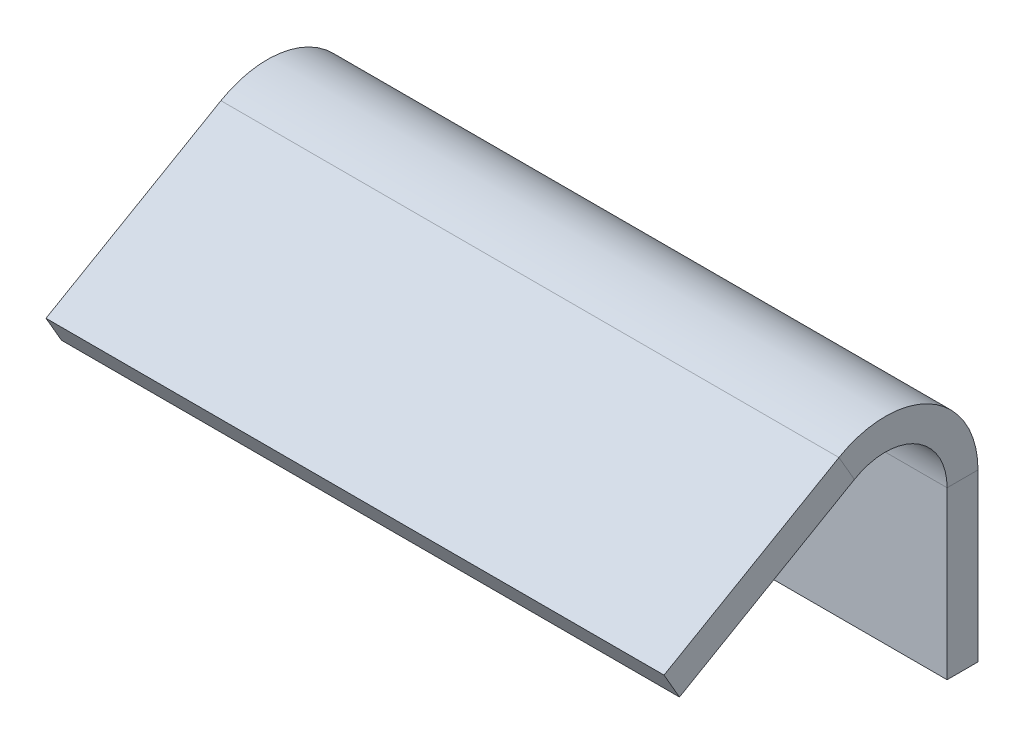
ISO-10303-21;
HEADER;
FILE_DESCRIPTION(('STEP AP214'),'2;1');
FILE_NAME('part.step','',(''),(''),'','','');
FILE_SCHEMA(('AUTOMOTIVE_DESIGN { 1 0 10303 214 1 1 1 1 }'));
ENDSEC;
DATA;
#1=APPLICATION_CONTEXT('core data for automotive mechanical design processes');
#2=APPLICATION_PROTOCOL_DEFINITION('international standard','automotive_design',2000,#1);
#3=PRODUCT_CONTEXT('',#1,'mechanical');
#4=PRODUCT('Part','Part','',(#3));
#5=PRODUCT_RELATED_PRODUCT_CATEGORY('part','',(#4));
#6=PRODUCT_DEFINITION_FORMATION('','',#4);
#7=PRODUCT_DEFINITION_CONTEXT('part definition',#1,'design');
#8=PRODUCT_DEFINITION('design','',#6,#7);
#9=PRODUCT_DEFINITION_SHAPE('','',#8);
#10=(LENGTH_UNIT() NAMED_UNIT(*) SI_UNIT(.MILLI.,.METRE.));
#11=(NAMED_UNIT(*) PLANE_ANGLE_UNIT() SI_UNIT($,.RADIAN.));
#12=(NAMED_UNIT(*) SI_UNIT($,.STERADIAN.) SOLID_ANGLE_UNIT());
#13=UNCERTAINTY_MEASURE_WITH_UNIT(LENGTH_MEASURE(1.E-05),#10,'distance_accuracy_value','');
#14=(GEOMETRIC_REPRESENTATION_CONTEXT(3) GLOBAL_UNCERTAINTY_ASSIGNED_CONTEXT((#13)) GLOBAL_UNIT_ASSIGNED_CONTEXT((#10,
#11,#12)) REPRESENTATION_CONTEXT('',''));
#15=CARTESIAN_POINT('',(0.,0.,0.));
#16=DIRECTION('',(0.,0.,1.));
#17=DIRECTION('',(1.,0.,0.));
#18=AXIS2_PLACEMENT_3D('',#15,#16,#17);
#19=CARTESIAN_POINT('',(0.,0.,-1.));
#20=DIRECTION('',(-1.,0.,0.));
#21=DIRECTION('',(0.,0.,1.));
#22=AXIS2_PLACEMENT_3D('',#19,#20,#21);
#23=PLANE('',#22);
#24=DIRECTION('',(0.,-1.,0.));
#25=VECTOR('',#24,1.);
#26=CARTESIAN_POINT('',(0.,0.,0.));
#27=LINE('',#26,#25);
#28=CARTESIAN_POINT('',(0.,5.38119784648303,0.));
#29=VERTEX_POINT('',#28);
#30=CARTESIAN_POINT('',(0.,0.,0.));
#31=VERTEX_POINT('',#30);
#32=EDGE_CURVE('E119',#29,#31,#27,.T.);
#33=ORIENTED_EDGE('',*,*,#32,.F.);
#34=DIRECTION('',(0.,0.,-1.));
#35=VECTOR('',#34,1.);
#36=CARTESIAN_POINT('',(0.,5.38119784648303,0.));
#37=LINE('',#36,#35);
#38=CARTESIAN_POINT('',(0.,5.38119784648303,-1.));
#39=VERTEX_POINT('',#38);
#40=EDGE_CURVE('E127',#29,#39,#37,.T.);
#41=ORIENTED_EDGE('',*,*,#40,.T.);
#42=DIRECTION('',(0.,-1.,0.));
#43=VECTOR('',#42,1.);
#44=CARTESIAN_POINT('',(0.,0.,-1.));
#45=LINE('',#44,#43);
#46=CARTESIAN_POINT('',(0.,0.,-1.));
#47=VERTEX_POINT('',#46);
#48=EDGE_CURVE('E114',#39,#47,#45,.T.);
#49=ORIENTED_EDGE('',*,*,#48,.T.);
#50=DIRECTION('',(0.,0.,1.));
#51=VECTOR('',#50,1.);
#52=CARTESIAN_POINT('',(0.,0.,-1.));
#53=LINE('',#52,#51);
#54=EDGE_CURVE('E69',#47,#31,#53,.T.);
#55=ORIENTED_EDGE('',*,*,#54,.T.);
#56=EDGE_LOOP('',(#33,#41,#49,#55));
#57=FACE_BOUND('',#56,.T.);
#58=ADVANCED_FACE('F61',(#57),#23,.T.);
#59=CARTESIAN_POINT('',(0.,0.,-1.));
#60=DIRECTION('',(0.,0.,-1.));
#61=DIRECTION('',(-1.,0.,0.));
#62=AXIS2_PLACEMENT_3D('',#59,#60,#61);
#63=PLANE('',#62);
#64=ORIENTED_EDGE('',*,*,#48,.F.);
#65=DIRECTION('',(-1.,0.,0.));
#66=VECTOR('',#65,1.);
#67=CARTESIAN_POINT('',(0.,5.38119784648303,-1.));
#68=LINE('',#67,#66);
#69=CARTESIAN_POINT('',(20.,5.38119784648303,-1.));
#70=VERTEX_POINT('',#69);
#71=EDGE_CURVE('E141',#39,#70,#68,.F.);
#72=ORIENTED_EDGE('',*,*,#71,.T.);
#73=DIRECTION('',(0.,1.,0.));
#74=VECTOR('',#73,1.);
#75=CARTESIAN_POINT('',(20.,0.,-1.));
#76=LINE('',#75,#74);
#77=CARTESIAN_POINT('',(20.,0.,-1.));
#78=VERTEX_POINT('',#77);
#79=EDGE_CURVE('E122',#78,#70,#76,.T.);
#80=ORIENTED_EDGE('',*,*,#79,.F.);
#81=DIRECTION('',(1.,0.,0.));
#82=VECTOR('',#81,1.);
#83=CARTESIAN_POINT('',(0.,0.,-1.));
#84=LINE('',#83,#82);
#85=EDGE_CURVE('E102',#47,#78,#84,.T.);
#86=ORIENTED_EDGE('',*,*,#85,.F.);
#87=EDGE_LOOP('',(#64,#72,#80,#86));
#88=FACE_BOUND('',#87,.T.);
#89=ADVANCED_FACE('F233',(#88),#63,.T.);
#90=CARTESIAN_POINT('',(0.,0.,0.));
#91=DIRECTION('',(0.,0.,-1.));
#92=DIRECTION('',(-1.,0.,0.));
#93=AXIS2_PLACEMENT_3D('',#90,#91,#92);
#94=PLANE('',#93);
#95=DIRECTION('',(-1.,0.,0.));
#96=VECTOR('',#95,1.);
#97=CARTESIAN_POINT('',(0.,5.38119784648303,0.));
#98=LINE('',#97,#96);
#99=CARTESIAN_POINT('',(20.,5.38119784648303,0.));
#100=VERTEX_POINT('',#99);
#101=EDGE_CURVE('E132',#29,#100,#98,.F.);
#102=ORIENTED_EDGE('',*,*,#101,.F.);
#103=ORIENTED_EDGE('',*,*,#32,.T.);
#104=DIRECTION('',(1.,0.,0.));
#105=VECTOR('',#104,1.);
#106=CARTESIAN_POINT('',(0.,0.,0.));
#107=LINE('',#106,#105);
#108=CARTESIAN_POINT('',(20.,0.,0.));
#109=VERTEX_POINT('',#108);
#110=EDGE_CURVE('E105',#31,#109,#107,.T.);
#111=ORIENTED_EDGE('',*,*,#110,.T.);
#112=DIRECTION('',(0.,1.,0.));
#113=VECTOR('',#112,1.);
#114=CARTESIAN_POINT('',(20.,0.,0.));
#115=LINE('',#114,#113);
#116=EDGE_CURVE('E110',#109,#100,#115,.T.);
#117=ORIENTED_EDGE('',*,*,#116,.T.);
#118=EDGE_LOOP('',(#102,#103,#111,#117));
#119=FACE_BOUND('',#118,.T.);
#120=ADVANCED_FACE('F113',(#119),#94,.F.);
#121=CARTESIAN_POINT('',(20.,0.,-1.));
#122=DIRECTION('',(1.,0.,0.));
#123=DIRECTION('',(0.,0.,-1.));
#124=AXIS2_PLACEMENT_3D('',#121,#122,#123);
#125=PLANE('',#124);
#126=DIRECTION('',(0.,0.,-1.));
#127=VECTOR('',#126,1.);
#128=CARTESIAN_POINT('',(20.,5.38119784648303,0.));
#129=LINE('',#128,#127);
#130=EDGE_CURVE('E109',#100,#70,#129,.T.);
#131=ORIENTED_EDGE('',*,*,#130,.F.);
#132=ORIENTED_EDGE('',*,*,#116,.F.);
#133=DIRECTION('',(0.,0.,1.));
#134=VECTOR('',#133,1.);
#135=CARTESIAN_POINT('',(20.,0.,-1.));
#136=LINE('',#135,#134);
#137=EDGE_CURVE('E13',#78,#109,#136,.T.);
#138=ORIENTED_EDGE('',*,*,#137,.F.);
#139=ORIENTED_EDGE('',*,*,#79,.T.);
#140=EDGE_LOOP('',(#131,#132,#138,#139));
#141=FACE_BOUND('',#140,.T.);
#142=ADVANCED_FACE('F107',(#141),#125,.T.);
#143=CARTESIAN_POINT('',(0.,0.,-1.));
#144=DIRECTION('',(0.,-1.,0.));
#145=DIRECTION('',(0.,0.,-1.));
#146=AXIS2_PLACEMENT_3D('',#143,#144,#145);
#147=PLANE('',#146);
#148=ORIENTED_EDGE('',*,*,#110,.F.);
#149=ORIENTED_EDGE('',*,*,#54,.F.);
#150=ORIENTED_EDGE('',*,*,#85,.T.);
#151=ORIENTED_EDGE('',*,*,#137,.T.);
#152=EDGE_LOOP('',(#148,#149,#150,#151));
#153=FACE_BOUND('',#152,.T.);
#154=ADVANCED_FACE('F97',(#153),#147,.T.);
#155=CARTESIAN_POINT('',(20.,5.38119784648303,2.));
#156=DIRECTION('',(1.,0.,0.));
#157=DIRECTION('',(0.,0.,-1.));
#158=AXIS2_PLACEMENT_3D('',#155,#156,#157);
#159=PLANE('',#158);
#160=DIRECTION('',(0.,-0.866025403784442,-0.499999999999994));
#161=VECTOR('',#160,1.);
#162=CARTESIAN_POINT('',(20.,7.97927405783636,3.49999999999998));
#163=LINE('',#162,#161);
#164=CARTESIAN_POINT('',(20.,7.11324865405191,2.99999999999999));
#165=VERTEX_POINT('',#164);
#166=CARTESIAN_POINT('',(20.,7.97927405783635,3.49999999999998));
#167=VERTEX_POINT('',#166);
#168=EDGE_CURVE('E150',#165,#167,#163,.F.);
#169=ORIENTED_EDGE('',*,*,#168,.F.);
#170=CARTESIAN_POINT('',(20.,5.38119784648303,2.));
#171=DIRECTION('',(-1.,0.,0.));
#172=DIRECTION('',(0.,0.,1.));
#173=AXIS2_PLACEMENT_3D('',#170,#171,#172);
#174=CIRCLE('',#173,2.);
#175=EDGE_CURVE('E137',#100,#165,#174,.F.);
#176=ORIENTED_EDGE('',*,*,#175,.F.);
#177=ORIENTED_EDGE('',*,*,#130,.T.);
#178=CARTESIAN_POINT('',(20.,5.38119784648303,2.));
#179=DIRECTION('',(-1.,0.,0.));
#180=DIRECTION('',(0.,0.,1.));
#181=AXIS2_PLACEMENT_3D('',#178,#179,#180);
#182=CIRCLE('',#181,3.);
#183=EDGE_CURVE('E80',#70,#167,#182,.F.);
#184=ORIENTED_EDGE('',*,*,#183,.T.);
#185=EDGE_LOOP('',(#169,#176,#177,#184));
#186=FACE_BOUND('',#185,.T.);
#187=ADVANCED_FACE('F231',(#186),#159,.T.);
#188=CARTESIAN_POINT('',(0.,5.38119784648303,2.));
#189=DIRECTION('',(1.,0.,0.));
#190=DIRECTION('',(0.,0.,-1.));
#191=AXIS2_PLACEMENT_3D('',#188,#189,#190);
#192=PLANE('',#191);
#193=CARTESIAN_POINT('',(0.,5.38119784648303,2.));
#194=DIRECTION('',(-1.,0.,0.));
#195=DIRECTION('',(0.,0.,1.));
#196=AXIS2_PLACEMENT_3D('',#193,#194,#195);
#197=CIRCLE('',#196,2.);
#198=CARTESIAN_POINT('',(0.,7.11324865405191,2.99999999999999));
#199=VERTEX_POINT('',#198);
#200=EDGE_CURVE('E128',#199,#29,#197,.T.);
#201=ORIENTED_EDGE('',*,*,#200,.F.);
#202=DIRECTION('',(0.,-0.866025403784442,-0.499999999999994));
#203=VECTOR('',#202,1.);
#204=CARTESIAN_POINT('',(0.,7.11324865405191,2.99999999999999));
#205=LINE('',#204,#203);
#206=CARTESIAN_POINT('',(0.,7.97927405783635,3.49999999999998));
#207=VERTEX_POINT('',#206);
#208=EDGE_CURVE('E153',#199,#207,#205,.F.);
#209=ORIENTED_EDGE('',*,*,#208,.T.);
#210=CARTESIAN_POINT('',(0.,5.38119784648303,2.));
#211=DIRECTION('',(-1.,0.,0.));
#212=DIRECTION('',(0.,0.,1.));
#213=AXIS2_PLACEMENT_3D('',#210,#211,#212);
#214=CIRCLE('',#213,3.);
#215=EDGE_CURVE('E140',#207,#39,#214,.T.);
#216=ORIENTED_EDGE('',*,*,#215,.T.);
#217=ORIENTED_EDGE('',*,*,#40,.F.);
#218=EDGE_LOOP('',(#201,#209,#216,#217));
#219=FACE_BOUND('',#218,.T.);
#220=ADVANCED_FACE('F224',(#219),#192,.F.);
#221=CARTESIAN_POINT('',(0.,5.38119784648303,2.));
#222=DIRECTION('',(-1.,0.,0.));
#223=DIRECTION('',(0.,0.866025403784442,0.499999999999994));
#224=AXIS2_PLACEMENT_3D('',#221,#222,#223);
#225=CYLINDRICAL_SURFACE('',#224,3.);
#226=ORIENTED_EDGE('',*,*,#71,.F.);
#227=ORIENTED_EDGE('',*,*,#215,.F.);
#228=DIRECTION('',(-1.,0.,0.));
#229=VECTOR('',#228,1.);
#230=CARTESIAN_POINT('',(20.,7.97927405783635,3.49999999999998));
#231=LINE('',#230,#229);
#232=EDGE_CURVE('E156',#207,#167,#231,.F.);
#233=ORIENTED_EDGE('',*,*,#232,.T.);
#234=ORIENTED_EDGE('',*,*,#183,.F.);
#235=EDGE_LOOP('',(#226,#227,#233,#234));
#236=FACE_BOUND('',#235,.T.);
#237=ADVANCED_FACE('F230',(#236),#225,.T.);
#238=CARTESIAN_POINT('',(0.,5.38119784648303,2.));
#239=DIRECTION('',(-1.,0.,0.));
#240=DIRECTION('',(0.,0.866025403784442,0.499999999999994));
#241=AXIS2_PLACEMENT_3D('',#238,#239,#240);
#242=CYLINDRICAL_SURFACE('',#241,2.);
#243=ORIENTED_EDGE('',*,*,#101,.T.);
#244=ORIENTED_EDGE('',*,*,#175,.T.);
#245=DIRECTION('',(-1.,0.,0.));
#246=VECTOR('',#245,1.);
#247=CARTESIAN_POINT('',(20.,7.11324865405191,2.99999999999999));
#248=LINE('',#247,#246);
#249=EDGE_CURVE('E147',#165,#199,#248,.T.);
#250=ORIENTED_EDGE('',*,*,#249,.T.);
#251=ORIENTED_EDGE('',*,*,#200,.T.);
#252=EDGE_LOOP('',(#243,#244,#250,#251));
#253=FACE_BOUND('',#252,.T.);
#254=ADVANCED_FACE('F217',(#253),#242,.F.);
#255=CARTESIAN_POINT('',(20.,9.7113248654052,0.499999999999993));
#256=DIRECTION('',(-1.,0.,0.));
#257=DIRECTION('',(0.,0.,1.));
#258=AXIS2_PLACEMENT_3D('',#255,#256,#257);
#259=PLANE('',#258);
#260=ORIENTED_EDGE('',*,*,#168,.T.);
#261=DIRECTION('',(0.,0.499999999999994,-0.866025403784442));
#262=VECTOR('',#261,1.);
#263=CARTESIAN_POINT('',(20.,7.21132486540526,4.83012701892215));
#264=LINE('',#263,#262);
#265=CARTESIAN_POINT('',(20.,4.71132486540526,9.16025403784441));
#266=VERTEX_POINT('',#265);
#267=EDGE_CURVE('E170',#266,#167,#264,.T.);
#268=ORIENTED_EDGE('',*,*,#267,.F.);
#269=DIRECTION('',(0.,-0.866025403784442,-0.499999999999994));
#270=VECTOR('',#269,1.);
#271=CARTESIAN_POINT('',(20.,4.71132486540526,9.16025403784441));
#272=LINE('',#271,#270);
#273=CARTESIAN_POINT('',(20.,3.84529946162081,8.66025403784442));
#274=VERTEX_POINT('',#273);
#275=EDGE_CURVE('E176',#266,#274,#272,.T.);
#276=ORIENTED_EDGE('',*,*,#275,.T.);
#277=DIRECTION('',(0.,-0.499999999999994,0.866025403784442));
#278=VECTOR('',#277,1.);
#279=CARTESIAN_POINT('',(20.,8.84529946162075,0.));
#280=LINE('',#279,#278);
#281=EDGE_CURVE('E158',#274,#165,#280,.F.);
#282=ORIENTED_EDGE('',*,*,#281,.T.);
#283=EDGE_LOOP('',(#260,#268,#276,#282));
#284=FACE_BOUND('',#283,.T.);
#285=ADVANCED_FACE('F228',(#284),#259,.F.);
#286=CARTESIAN_POINT('',(0.,9.7113248654052,0.499999999999993));
#287=DIRECTION('',(1.,0.,0.));
#288=DIRECTION('',(0.,0.,-1.));
#289=AXIS2_PLACEMENT_3D('',#286,#287,#288);
#290=PLANE('',#289);
#291=ORIENTED_EDGE('',*,*,#208,.F.);
#292=DIRECTION('',(0.,0.499999999999994,-0.866025403784442));
#293=VECTOR('',#292,1.);
#294=CARTESIAN_POINT('',(0.,8.84529946162075,0.));
#295=LINE('',#294,#293);
#296=CARTESIAN_POINT('',(0.,3.84529946162081,8.66025403784442));
#297=VERTEX_POINT('',#296);
#298=EDGE_CURVE('E161',#199,#297,#295,.F.);
#299=ORIENTED_EDGE('',*,*,#298,.T.);
#300=DIRECTION('',(0.,-0.866025403784442,-0.499999999999994));
#301=VECTOR('',#300,1.);
#302=CARTESIAN_POINT('',(0.,4.71132486540526,9.16025403784441));
#303=LINE('',#302,#301);
#304=CARTESIAN_POINT('',(0.,4.71132486540526,9.16025403784441));
#305=VERTEX_POINT('',#304);
#306=EDGE_CURVE('E135',#305,#297,#303,.T.);
#307=ORIENTED_EDGE('',*,*,#306,.F.);
#308=DIRECTION('',(0.,-0.499999999999994,0.866025403784442));
#309=VECTOR('',#308,1.);
#310=CARTESIAN_POINT('',(0.,7.21132486540526,4.83012701892215));
#311=LINE('',#310,#309);
#312=EDGE_CURVE('E168',#207,#305,#311,.T.);
#313=ORIENTED_EDGE('',*,*,#312,.F.);
#314=EDGE_LOOP('',(#291,#299,#307,#313));
#315=FACE_BOUND('',#314,.T.);
#316=ADVANCED_FACE('F193',(#315),#290,.F.);
#317=CARTESIAN_POINT('',(0.,7.21132486540526,4.83012701892215));
#318=DIRECTION('',(0.,-0.866025403784442,-0.499999999999994));
#319=DIRECTION('',(0.,0.499999999999994,-0.866025403784442));
#320=AXIS2_PLACEMENT_3D('',#317,#318,#319);
#321=PLANE('',#320);
#322=ORIENTED_EDGE('',*,*,#232,.F.);
#323=ORIENTED_EDGE('',*,*,#312,.T.);
#324=DIRECTION('',(1.,0.,0.));
#325=VECTOR('',#324,1.);
#326=CARTESIAN_POINT('',(0.,4.71132486540526,9.16025403784441));
#327=LINE('',#326,#325);
#328=EDGE_CURVE('E172',#305,#266,#327,.T.);
#329=ORIENTED_EDGE('',*,*,#328,.T.);
#330=ORIENTED_EDGE('',*,*,#267,.T.);
#331=EDGE_LOOP('',(#322,#323,#329,#330));
#332=FACE_BOUND('',#331,.T.);
#333=ADVANCED_FACE('F227',(#332),#321,.F.);
#334=CARTESIAN_POINT('',(0.,6.34529946162082,4.33012701892216));
#335=DIRECTION('',(0.,-0.866025403784442,-0.499999999999994));
#336=DIRECTION('',(0.,0.499999999999994,-0.866025403784442));
#337=AXIS2_PLACEMENT_3D('',#334,#335,#336);
#338=PLANE('',#337);
#339=ORIENTED_EDGE('',*,*,#298,.F.);
#340=ORIENTED_EDGE('',*,*,#249,.F.);
#341=ORIENTED_EDGE('',*,*,#281,.F.);
#342=DIRECTION('',(-1.,0.,0.));
#343=VECTOR('',#342,1.);
#344=CARTESIAN_POINT('',(20.,3.84529946162082,8.66025403784442));
#345=LINE('',#344,#343);
#346=EDGE_CURVE('E163',#297,#274,#345,.F.);
#347=ORIENTED_EDGE('',*,*,#346,.F.);
#348=EDGE_LOOP('',(#339,#340,#341,#347));
#349=FACE_BOUND('',#348,.T.);
#350=ADVANCED_FACE('F221',(#349),#338,.T.);
#351=CARTESIAN_POINT('',(20.,4.71132486540526,9.16025403784441));
#352=DIRECTION('',(0.,0.499999999999994,-0.866025403784442));
#353=DIRECTION('',(0.,0.866025403784442,0.499999999999994));
#354=AXIS2_PLACEMENT_3D('',#351,#352,#353);
#355=PLANE('',#354);
#356=ORIENTED_EDGE('',*,*,#346,.T.);
#357=ORIENTED_EDGE('',*,*,#275,.F.);
#358=ORIENTED_EDGE('',*,*,#328,.F.);
#359=ORIENTED_EDGE('',*,*,#306,.T.);
#360=EDGE_LOOP('',(#356,#357,#358,#359));
#361=FACE_BOUND('',#360,.T.);
#362=ADVANCED_FACE('F184',(#361),#355,.F.);
#363=CLOSED_SHELL('',(#58,#89,#120,#142,#154,#187,#220,#237,#254,#285,#316,#333,#350,#362));
#364=MANIFOLD_SOLID_BREP('B2',#363);
#365=ADVANCED_BREP_SHAPE_REPRESENTATION('',(#18,#364),#14);
#366=SHAPE_DEFINITION_REPRESENTATION(#9,#365);
ENDSEC;
END-ISO-10303-21;
